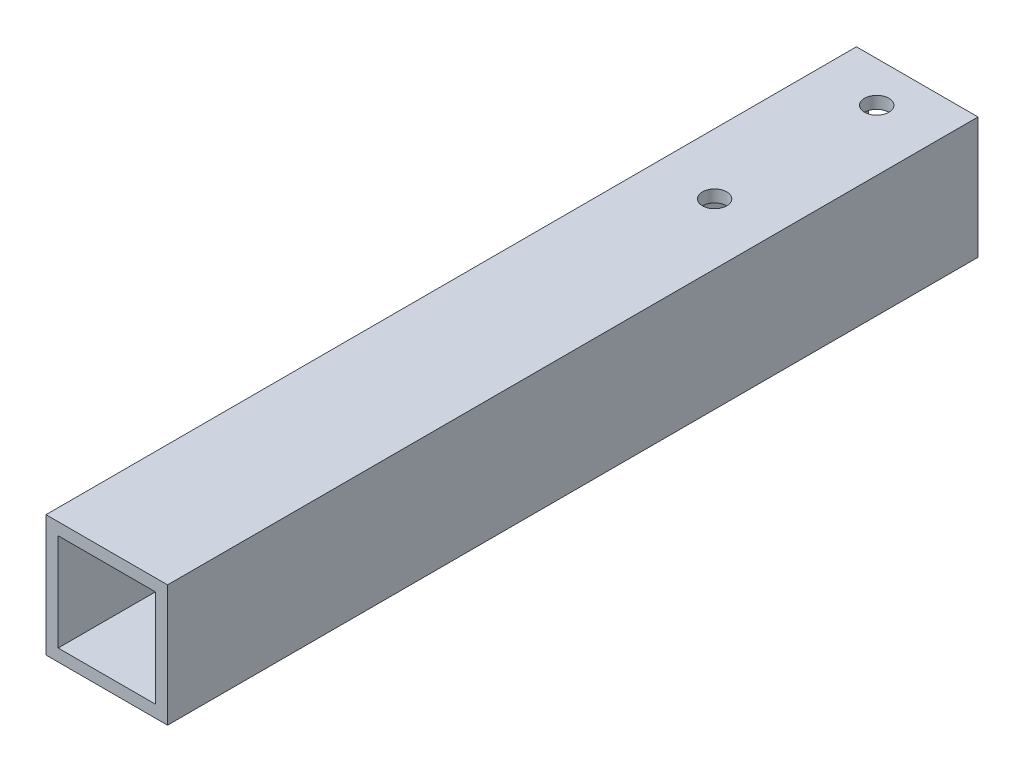
ISO-10303-21;
HEADER;
FILE_DESCRIPTION(('STEP AP214'),'2;1');
FILE_NAME('part.step','',(''),(''),'','','');
FILE_SCHEMA(('AUTOMOTIVE_DESIGN { 1 0 10303 214 1 1 1 1 }'));
ENDSEC;
DATA;
#1=APPLICATION_CONTEXT('core data for automotive mechanical design processes');
#2=APPLICATION_PROTOCOL_DEFINITION('international standard','automotive_design',2000,#1);
#3=PRODUCT_CONTEXT('',#1,'mechanical');
#4=PRODUCT('Part','Part','',(#3));
#5=PRODUCT_RELATED_PRODUCT_CATEGORY('part','',(#4));
#6=PRODUCT_DEFINITION_FORMATION('','',#4);
#7=PRODUCT_DEFINITION_CONTEXT('part definition',#1,'design');
#8=PRODUCT_DEFINITION('design','',#6,#7);
#9=PRODUCT_DEFINITION_SHAPE('','',#8);
#10=(LENGTH_UNIT() NAMED_UNIT(*) SI_UNIT(.MILLI.,.METRE.));
#11=(NAMED_UNIT(*) PLANE_ANGLE_UNIT() SI_UNIT($,.RADIAN.));
#12=(NAMED_UNIT(*) SI_UNIT($,.STERADIAN.) SOLID_ANGLE_UNIT());
#13=UNCERTAINTY_MEASURE_WITH_UNIT(LENGTH_MEASURE(1.E-05),#10,'distance_accuracy_value','');
#14=(GEOMETRIC_REPRESENTATION_CONTEXT(3) GLOBAL_UNCERTAINTY_ASSIGNED_CONTEXT((#13)) GLOBAL_UNIT_ASSIGNED_CONTEXT((#10,
#11,#12)) REPRESENTATION_CONTEXT('',''));
#15=CARTESIAN_POINT('',(0.,0.,0.));
#16=DIRECTION('',(0.,0.,1.));
#17=DIRECTION('',(1.,0.,0.));
#18=AXIS2_PLACEMENT_3D('',#15,#16,#17);
#19=CARTESIAN_POINT('',(7.5,-7.49999999999999,100.));
#20=DIRECTION('',(-1.,0.,0.));
#21=DIRECTION('',(0.,0.,1.));
#22=AXIS2_PLACEMENT_3D('',#19,#20,#21);
#23=PLANE('',#22);
#24=DIRECTION('',(0.,1.,0.));
#25=VECTOR('',#24,1.);
#26=CARTESIAN_POINT('',(7.5,-7.49999999999999,0.));
#27=LINE('',#26,#25);
#28=CARTESIAN_POINT('',(7.5,-7.49999999999999,0.));
#29=VERTEX_POINT('',#28);
#30=CARTESIAN_POINT('',(7.5,7.50000000000001,0.));
#31=VERTEX_POINT('',#30);
#32=EDGE_CURVE('E133',#29,#31,#27,.T.);
#33=ORIENTED_EDGE('',*,*,#32,.T.);
#34=DIRECTION('',(0.,0.,-1.));
#35=VECTOR('',#34,1.);
#36=CARTESIAN_POINT('',(7.5,7.50000000000001,100.));
#37=LINE('',#36,#35);
#38=CARTESIAN_POINT('',(7.5,7.50000000000001,100.));
#39=VERTEX_POINT('',#38);
#40=EDGE_CURVE('E11',#39,#31,#37,.T.);
#41=ORIENTED_EDGE('',*,*,#40,.F.);
#42=DIRECTION('',(0.,1.,0.));
#43=VECTOR('',#42,1.);
#44=CARTESIAN_POINT('',(7.5,-7.49999999999999,100.));
#45=LINE('',#44,#43);
#46=CARTESIAN_POINT('',(7.5,-7.49999999999999,100.));
#47=VERTEX_POINT('',#46);
#48=EDGE_CURVE('E137',#47,#39,#45,.T.);
#49=ORIENTED_EDGE('',*,*,#48,.F.);
#50=DIRECTION('',(0.,0.,-1.));
#51=VECTOR('',#50,1.);
#52=CARTESIAN_POINT('',(7.5,-7.49999999999999,100.));
#53=LINE('',#52,#51);
#54=EDGE_CURVE('E147',#47,#29,#53,.T.);
#55=ORIENTED_EDGE('',*,*,#54,.T.);
#56=EDGE_LOOP('',(#33,#41,#49,#55));
#57=FACE_BOUND('',#56,.T.);
#58=ADVANCED_FACE('F31',(#57),#23,.F.);
#59=CARTESIAN_POINT('',(-7.5,7.50000000000001,100.));
#60=DIRECTION('',(0.,-1.,0.));
#61=DIRECTION('',(0.,0.,-1.));
#62=AXIS2_PLACEMENT_3D('',#59,#60,#61);
#63=PLANE('',#62);
#64=CARTESIAN_POINT('',(0.,7.50000000000001,25.));
#65=DIRECTION('',(0.,1.,0.));
#66=DIRECTION('',(0.,0.,1.));
#67=AXIS2_PLACEMENT_3D('',#64,#65,#66);
#68=CIRCLE('',#67,1.5);
#69=CARTESIAN_POINT('',(0.,7.50000000000001,26.5));
#70=VERTEX_POINT('',#69);
#71=EDGE_CURVE('E177',#70,#70,#68,.T.);
#72=ORIENTED_EDGE('',*,*,#71,.F.);
#73=EDGE_LOOP('',(#72));
#74=FACE_BOUND('',#73,.T.);
#75=CARTESIAN_POINT('',(0.,7.50000000000001,5.));
#76=DIRECTION('',(0.,1.,0.));
#77=DIRECTION('',(0.,0.,1.));
#78=AXIS2_PLACEMENT_3D('',#75,#76,#77);
#79=CIRCLE('',#78,1.5);
#80=CARTESIAN_POINT('',(0.,7.50000000000001,6.50000000000001));
#81=VERTEX_POINT('',#80);
#82=EDGE_CURVE('E168',#81,#81,#79,.T.);
#83=ORIENTED_EDGE('',*,*,#82,.F.);
#84=EDGE_LOOP('',(#83));
#85=FACE_BOUND('',#84,.T.);
#86=DIRECTION('',(-1.,0.,0.));
#87=VECTOR('',#86,1.);
#88=CARTESIAN_POINT('',(-7.5,7.50000000000001,0.));
#89=LINE('',#88,#87);
#90=CARTESIAN_POINT('',(-7.5,7.50000000000001,0.));
#91=VERTEX_POINT('',#90);
#92=EDGE_CURVE('E150',#31,#91,#89,.T.);
#93=ORIENTED_EDGE('',*,*,#92,.T.);
#94=DIRECTION('',(0.,0.,-1.));
#95=VECTOR('',#94,1.);
#96=CARTESIAN_POINT('',(-7.5,7.50000000000001,100.));
#97=LINE('',#96,#95);
#98=CARTESIAN_POINT('',(-7.5,7.50000000000001,100.));
#99=VERTEX_POINT('',#98);
#100=EDGE_CURVE('E39',#99,#91,#97,.T.);
#101=ORIENTED_EDGE('',*,*,#100,.F.);
#102=DIRECTION('',(-1.,0.,0.));
#103=VECTOR('',#102,1.);
#104=CARTESIAN_POINT('',(-7.5,7.50000000000001,100.));
#105=LINE('',#104,#103);
#106=EDGE_CURVE('E140',#39,#99,#105,.T.);
#107=ORIENTED_EDGE('',*,*,#106,.F.);
#108=ORIENTED_EDGE('',*,*,#40,.T.);
#109=EDGE_LOOP('',(#93,#101,#107,#108));
#110=FACE_BOUND('',#109,.T.);
#111=ADVANCED_FACE('F203',(#74,#85,#110),#63,.F.);
#112=CARTESIAN_POINT('',(-7.5,-7.49999999999999,100.));
#113=DIRECTION('',(1.,0.,0.));
#114=DIRECTION('',(0.,0.,-1.));
#115=AXIS2_PLACEMENT_3D('',#112,#113,#114);
#116=PLANE('',#115);
#117=DIRECTION('',(0.,-1.,0.));
#118=VECTOR('',#117,1.);
#119=CARTESIAN_POINT('',(-7.5,-7.49999999999999,0.));
#120=LINE('',#119,#118);
#121=CARTESIAN_POINT('',(-7.5,-7.49999999999999,0.));
#122=VERTEX_POINT('',#121);
#123=EDGE_CURVE('E152',#91,#122,#120,.T.);
#124=ORIENTED_EDGE('',*,*,#123,.T.);
#125=DIRECTION('',(0.,0.,-1.));
#126=VECTOR('',#125,1.);
#127=CARTESIAN_POINT('',(-7.5,-7.49999999999999,100.));
#128=LINE('',#127,#126);
#129=CARTESIAN_POINT('',(-7.5,-7.49999999999999,100.));
#130=VERTEX_POINT('',#129);
#131=EDGE_CURVE('E157',#130,#122,#128,.T.);
#132=ORIENTED_EDGE('',*,*,#131,.F.);
#133=DIRECTION('',(0.,-1.,0.));
#134=VECTOR('',#133,1.);
#135=CARTESIAN_POINT('',(-7.5,-7.49999999999999,100.));
#136=LINE('',#135,#134);
#137=EDGE_CURVE('E143',#99,#130,#136,.T.);
#138=ORIENTED_EDGE('',*,*,#137,.F.);
#139=ORIENTED_EDGE('',*,*,#100,.T.);
#140=EDGE_LOOP('',(#124,#132,#138,#139));
#141=FACE_BOUND('',#140,.T.);
#142=ADVANCED_FACE('F208',(#141),#116,.F.);
#143=CARTESIAN_POINT('',(-7.5,-7.49999999999999,100.));
#144=DIRECTION('',(0.,1.,0.));
#145=DIRECTION('',(0.,0.,1.));
#146=AXIS2_PLACEMENT_3D('',#143,#144,#145);
#147=PLANE('',#146);
#148=CARTESIAN_POINT('',(0.,-7.49999999999999,25.));
#149=DIRECTION('',(0.,1.,0.));
#150=DIRECTION('',(0.,0.,1.));
#151=AXIS2_PLACEMENT_3D('',#148,#149,#150);
#152=CIRCLE('',#151,1.5);
#153=CARTESIAN_POINT('',(0.,-7.49999999999999,26.5));
#154=VERTEX_POINT('',#153);
#155=EDGE_CURVE('E180',#154,#154,#152,.T.);
#156=ORIENTED_EDGE('',*,*,#155,.T.);
#157=EDGE_LOOP('',(#156));
#158=FACE_BOUND('',#157,.T.);
#159=CARTESIAN_POINT('',(0.,-7.49999999999999,5.));
#160=DIRECTION('',(0.,1.,0.));
#161=DIRECTION('',(0.,0.,1.));
#162=AXIS2_PLACEMENT_3D('',#159,#160,#161);
#163=CIRCLE('',#162,1.5);
#164=CARTESIAN_POINT('',(0.,-7.49999999999999,6.50000000000001));
#165=VERTEX_POINT('',#164);
#166=EDGE_CURVE('E163',#165,#165,#163,.T.);
#167=ORIENTED_EDGE('',*,*,#166,.T.);
#168=EDGE_LOOP('',(#167));
#169=FACE_BOUND('',#168,.T.);
#170=DIRECTION('',(1.,0.,0.));
#171=VECTOR('',#170,1.);
#172=CARTESIAN_POINT('',(-7.5,-7.49999999999999,0.));
#173=LINE('',#172,#171);
#174=EDGE_CURVE('E141',#122,#29,#173,.T.);
#175=ORIENTED_EDGE('',*,*,#174,.T.);
#176=ORIENTED_EDGE('',*,*,#54,.F.);
#177=DIRECTION('',(1.,0.,0.));
#178=VECTOR('',#177,1.);
#179=CARTESIAN_POINT('',(-7.5,-7.49999999999999,100.));
#180=LINE('',#179,#178);
#181=EDGE_CURVE('E145',#130,#47,#180,.T.);
#182=ORIENTED_EDGE('',*,*,#181,.F.);
#183=ORIENTED_EDGE('',*,*,#131,.T.);
#184=EDGE_LOOP('',(#175,#176,#182,#183));
#185=FACE_BOUND('',#184,.T.);
#186=ADVANCED_FACE('F224',(#158,#169,#185),#147,.F.);
#187=CARTESIAN_POINT('',(7.5,7.50000000000001,100.));
#188=DIRECTION('',(0.,0.,-1.));
#189=DIRECTION('',(-1.,0.,0.));
#190=AXIS2_PLACEMENT_3D('',#187,#188,#189);
#191=PLANE('',#190);
#192=DIRECTION('',(-1.,0.,0.));
#193=VECTOR('',#192,1.);
#194=CARTESIAN_POINT('',(-6.,6.00000000000001,100.));
#195=LINE('',#194,#193);
#196=CARTESIAN_POINT('',(6.,6.00000000000001,100.));
#197=VERTEX_POINT('',#196);
#198=CARTESIAN_POINT('',(-6.,6.00000000000001,100.));
#199=VERTEX_POINT('',#198);
#200=EDGE_CURVE('E127',#197,#199,#195,.T.);
#201=ORIENTED_EDGE('',*,*,#200,.F.);
#202=DIRECTION('',(0.,1.,0.));
#203=VECTOR('',#202,1.);
#204=CARTESIAN_POINT('',(6.,-6.00000000000001,100.));
#205=LINE('',#204,#203);
#206=CARTESIAN_POINT('',(6.,-6.00000000000001,100.));
#207=VERTEX_POINT('',#206);
#208=EDGE_CURVE('E47',#207,#197,#205,.T.);
#209=ORIENTED_EDGE('',*,*,#208,.F.);
#210=DIRECTION('',(1.,0.,0.));
#211=VECTOR('',#210,1.);
#212=CARTESIAN_POINT('',(-6.,-6.00000000000001,100.));
#213=LINE('',#212,#211);
#214=CARTESIAN_POINT('',(-6.,-6.00000000000001,100.));
#215=VERTEX_POINT('',#214);
#216=EDGE_CURVE('E115',#215,#207,#213,.T.);
#217=ORIENTED_EDGE('',*,*,#216,.F.);
#218=DIRECTION('',(0.,-1.,0.));
#219=VECTOR('',#218,1.);
#220=CARTESIAN_POINT('',(-6.,-6.00000000000001,100.));
#221=LINE('',#220,#219);
#222=EDGE_CURVE('E118',#199,#215,#221,.T.);
#223=ORIENTED_EDGE('',*,*,#222,.F.);
#224=EDGE_LOOP('',(#201,#209,#217,#223));
#225=FACE_BOUND('',#224,.T.);
#226=ORIENTED_EDGE('',*,*,#48,.T.);
#227=ORIENTED_EDGE('',*,*,#106,.T.);
#228=ORIENTED_EDGE('',*,*,#137,.T.);
#229=ORIENTED_EDGE('',*,*,#181,.T.);
#230=EDGE_LOOP('',(#226,#227,#228,#229));
#231=FACE_BOUND('',#230,.T.);
#232=ADVANCED_FACE('F220',(#225,#231),#191,.F.);
#233=CARTESIAN_POINT('',(7.5,7.50000000000001,0.));
#234=DIRECTION('',(0.,0.,-1.));
#235=DIRECTION('',(-1.,0.,0.));
#236=AXIS2_PLACEMENT_3D('',#233,#234,#235);
#237=PLANE('',#236);
#238=DIRECTION('',(0.,1.,0.));
#239=VECTOR('',#238,1.);
#240=CARTESIAN_POINT('',(6.,-6.00000000000001,0.));
#241=LINE('',#240,#239);
#242=CARTESIAN_POINT('',(6.,-6.00000000000001,0.));
#243=VERTEX_POINT('',#242);
#244=CARTESIAN_POINT('',(6.,6.00000000000001,0.));
#245=VERTEX_POINT('',#244);
#246=EDGE_CURVE('E99',#243,#245,#241,.T.);
#247=ORIENTED_EDGE('',*,*,#246,.T.);
#248=DIRECTION('',(-1.,0.,0.));
#249=VECTOR('',#248,1.);
#250=CARTESIAN_POINT('',(-6.,6.00000000000001,0.));
#251=LINE('',#250,#249);
#252=CARTESIAN_POINT('',(-6.,6.00000000000001,0.));
#253=VERTEX_POINT('',#252);
#254=EDGE_CURVE('E108',#245,#253,#251,.T.);
#255=ORIENTED_EDGE('',*,*,#254,.T.);
#256=DIRECTION('',(0.,-1.,0.));
#257=VECTOR('',#256,1.);
#258=CARTESIAN_POINT('',(-6.,-6.00000000000001,0.));
#259=LINE('',#258,#257);
#260=CARTESIAN_POINT('',(-6.,-6.00000000000001,0.));
#261=VERTEX_POINT('',#260);
#262=EDGE_CURVE('E55',#253,#261,#259,.T.);
#263=ORIENTED_EDGE('',*,*,#262,.T.);
#264=DIRECTION('',(1.,0.,0.));
#265=VECTOR('',#264,1.);
#266=CARTESIAN_POINT('',(-6.,-6.00000000000001,0.));
#267=LINE('',#266,#265);
#268=EDGE_CURVE('E105',#261,#243,#267,.T.);
#269=ORIENTED_EDGE('',*,*,#268,.T.);
#270=EDGE_LOOP('',(#247,#255,#263,#269));
#271=FACE_BOUND('',#270,.T.);
#272=ORIENTED_EDGE('',*,*,#32,.F.);
#273=ORIENTED_EDGE('',*,*,#174,.F.);
#274=ORIENTED_EDGE('',*,*,#123,.F.);
#275=ORIENTED_EDGE('',*,*,#92,.F.);
#276=EDGE_LOOP('',(#272,#273,#274,#275));
#277=FACE_BOUND('',#276,.T.);
#278=ADVANCED_FACE('F112',(#271,#277),#237,.T.);
#279=CARTESIAN_POINT('',(6.,-6.00000000000001,0.));
#280=DIRECTION('',(1.,0.,0.));
#281=DIRECTION('',(0.,0.,-1.));
#282=AXIS2_PLACEMENT_3D('',#279,#280,#281);
#283=PLANE('',#282);
#284=ORIENTED_EDGE('',*,*,#208,.T.);
#285=DIRECTION('',(0.,0.,1.));
#286=VECTOR('',#285,1.);
#287=CARTESIAN_POINT('',(6.,6.00000000000001,0.));
#288=LINE('',#287,#286);
#289=EDGE_CURVE('E95',#245,#197,#288,.T.);
#290=ORIENTED_EDGE('',*,*,#289,.F.);
#291=ORIENTED_EDGE('',*,*,#246,.F.);
#292=DIRECTION('',(0.,0.,1.));
#293=VECTOR('',#292,1.);
#294=CARTESIAN_POINT('',(6.,-6.00000000000001,0.));
#295=LINE('',#294,#293);
#296=EDGE_CURVE('E131',#243,#207,#295,.T.);
#297=ORIENTED_EDGE('',*,*,#296,.T.);
#298=EDGE_LOOP('',(#284,#290,#291,#297));
#299=FACE_BOUND('',#298,.T.);
#300=ADVANCED_FACE('F97',(#299),#283,.F.);
#301=CARTESIAN_POINT('',(-6.,-6.00000000000001,0.));
#302=DIRECTION('',(0.,-1.,0.));
#303=DIRECTION('',(0.,0.,-1.));
#304=AXIS2_PLACEMENT_3D('',#301,#302,#303);
#305=PLANE('',#304);
#306=CARTESIAN_POINT('',(0.,-6.00000000000001,25.));
#307=DIRECTION('',(0.,-1.,0.));
#308=DIRECTION('',(0.,0.,-1.));
#309=AXIS2_PLACEMENT_3D('',#306,#307,#308);
#310=CIRCLE('',#309,1.5);
#311=CARTESIAN_POINT('',(0.,-6.00000000000001,23.5));
#312=VERTEX_POINT('',#311);
#313=EDGE_CURVE('E173',#312,#312,#310,.T.);
#314=ORIENTED_EDGE('',*,*,#313,.T.);
#315=EDGE_LOOP('',(#314));
#316=FACE_BOUND('',#315,.T.);
#317=CARTESIAN_POINT('',(0.,-6.00000000000001,5.));
#318=DIRECTION('',(0.,-1.,0.));
#319=DIRECTION('',(0.,0.,-1.));
#320=AXIS2_PLACEMENT_3D('',#317,#318,#319);
#321=CIRCLE('',#320,1.5);
#322=CARTESIAN_POINT('',(0.,-6.00000000000001,3.5));
#323=VERTEX_POINT('',#322);
#324=EDGE_CURVE('E121',#323,#323,#321,.T.);
#325=ORIENTED_EDGE('',*,*,#324,.T.);
#326=EDGE_LOOP('',(#325));
#327=FACE_BOUND('',#326,.T.);
#328=ORIENTED_EDGE('',*,*,#216,.T.);
#329=ORIENTED_EDGE('',*,*,#296,.F.);
#330=ORIENTED_EDGE('',*,*,#268,.F.);
#331=DIRECTION('',(0.,0.,1.));
#332=VECTOR('',#331,1.);
#333=CARTESIAN_POINT('',(-6.,-6.00000000000001,0.));
#334=LINE('',#333,#332);
#335=EDGE_CURVE('E134',#261,#215,#334,.T.);
#336=ORIENTED_EDGE('',*,*,#335,.T.);
#337=EDGE_LOOP('',(#328,#329,#330,#336));
#338=FACE_BOUND('',#337,.T.);
#339=ADVANCED_FACE('F240',(#316,#327,#338),#305,.F.);
#340=CARTESIAN_POINT('',(-6.,-6.00000000000001,0.));
#341=DIRECTION('',(-1.,0.,0.));
#342=DIRECTION('',(0.,0.,1.));
#343=AXIS2_PLACEMENT_3D('',#340,#341,#342);
#344=PLANE('',#343);
#345=ORIENTED_EDGE('',*,*,#222,.T.);
#346=ORIENTED_EDGE('',*,*,#335,.F.);
#347=ORIENTED_EDGE('',*,*,#262,.F.);
#348=DIRECTION('',(0.,0.,1.));
#349=VECTOR('',#348,1.);
#350=CARTESIAN_POINT('',(-6.,6.00000000000001,0.));
#351=LINE('',#350,#349);
#352=EDGE_CURVE('E104',#253,#199,#351,.T.);
#353=ORIENTED_EDGE('',*,*,#352,.T.);
#354=EDGE_LOOP('',(#345,#346,#347,#353));
#355=FACE_BOUND('',#354,.T.);
#356=ADVANCED_FACE('F243',(#355),#344,.F.);
#357=CARTESIAN_POINT('',(-6.,6.00000000000001,0.));
#358=DIRECTION('',(0.,1.,0.));
#359=DIRECTION('',(0.,0.,1.));
#360=AXIS2_PLACEMENT_3D('',#357,#358,#359);
#361=PLANE('',#360);
#362=CARTESIAN_POINT('',(0.,6.00000000000001,25.));
#363=DIRECTION('',(0.,1.,0.));
#364=DIRECTION('',(0.,0.,1.));
#365=AXIS2_PLACEMENT_3D('',#362,#363,#364);
#366=CIRCLE('',#365,1.5);
#367=CARTESIAN_POINT('',(0.,6.00000000000001,26.5));
#368=VERTEX_POINT('',#367);
#369=EDGE_CURVE('E34',#368,#368,#366,.T.);
#370=ORIENTED_EDGE('',*,*,#369,.T.);
#371=EDGE_LOOP('',(#370));
#372=FACE_BOUND('',#371,.T.);
#373=CARTESIAN_POINT('',(0.,6.00000000000001,5.));
#374=DIRECTION('',(0.,1.,0.));
#375=DIRECTION('',(0.,0.,1.));
#376=AXIS2_PLACEMENT_3D('',#373,#374,#375);
#377=CIRCLE('',#376,1.5);
#378=CARTESIAN_POINT('',(0.,6.00000000000001,6.50000000000001));
#379=VERTEX_POINT('',#378);
#380=EDGE_CURVE('E161',#379,#379,#377,.T.);
#381=ORIENTED_EDGE('',*,*,#380,.T.);
#382=EDGE_LOOP('',(#381));
#383=FACE_BOUND('',#382,.T.);
#384=ORIENTED_EDGE('',*,*,#200,.T.);
#385=ORIENTED_EDGE('',*,*,#352,.F.);
#386=ORIENTED_EDGE('',*,*,#254,.F.);
#387=ORIENTED_EDGE('',*,*,#289,.T.);
#388=EDGE_LOOP('',(#384,#385,#386,#387));
#389=FACE_BOUND('',#388,.T.);
#390=ADVANCED_FACE('F109',(#372,#383,#389),#361,.F.);
#391=CARTESIAN_POINT('',(0.,-7.49999999999999,5.));
#392=DIRECTION('',(0.,1.,0.));
#393=DIRECTION('',(0.,0.,1.));
#394=AXIS2_PLACEMENT_3D('',#391,#392,#393);
#395=CYLINDRICAL_SURFACE('',#394,1.5);
#396=ORIENTED_EDGE('',*,*,#82,.T.);
#397=EDGE_LOOP('',(#396));
#398=FACE_BOUND('',#397,.T.);
#399=ORIENTED_EDGE('',*,*,#380,.F.);
#400=EDGE_LOOP('',(#399));
#401=FACE_BOUND('',#400,.T.);
#402=ADVANCED_FACE('F199',(#398,#401),#395,.F.);
#403=ORIENTED_EDGE('',*,*,#166,.F.);
#404=EDGE_LOOP('',(#403));
#405=FACE_BOUND('',#404,.T.);
#406=ORIENTED_EDGE('',*,*,#324,.F.);
#407=EDGE_LOOP('',(#406));
#408=FACE_BOUND('',#407,.T.);
#409=ADVANCED_FACE('F191',(#405,#408),#395,.F.);
#410=CARTESIAN_POINT('',(0.,-7.49999999999999,25.));
#411=DIRECTION('',(0.,1.,0.));
#412=DIRECTION('',(0.,0.,1.));
#413=AXIS2_PLACEMENT_3D('',#410,#411,#412);
#414=CYLINDRICAL_SURFACE('',#413,1.5);
#415=ORIENTED_EDGE('',*,*,#71,.T.);
#416=EDGE_LOOP('',(#415));
#417=FACE_BOUND('',#416,.T.);
#418=ORIENTED_EDGE('',*,*,#369,.F.);
#419=EDGE_LOOP('',(#418));
#420=FACE_BOUND('',#419,.T.);
#421=ADVANCED_FACE('F188',(#417,#420),#414,.F.);
#422=ORIENTED_EDGE('',*,*,#155,.F.);
#423=EDGE_LOOP('',(#422));
#424=FACE_BOUND('',#423,.T.);
#425=ORIENTED_EDGE('',*,*,#313,.F.);
#426=EDGE_LOOP('',(#425));
#427=FACE_BOUND('',#426,.T.);
#428=ADVANCED_FACE('F190',(#424,#427),#414,.F.);
#429=CLOSED_SHELL('',(#58,#111,#142,#186,#232,#278,#300,#339,#356,#390,#402,#409,#421,#428));
#430=MANIFOLD_SOLID_BREP('B2',#429);
#431=ADVANCED_BREP_SHAPE_REPRESENTATION('',(#18,#430),#14);
#432=SHAPE_DEFINITION_REPRESENTATION(#9,#431);
ENDSEC;
END-ISO-10303-21;
